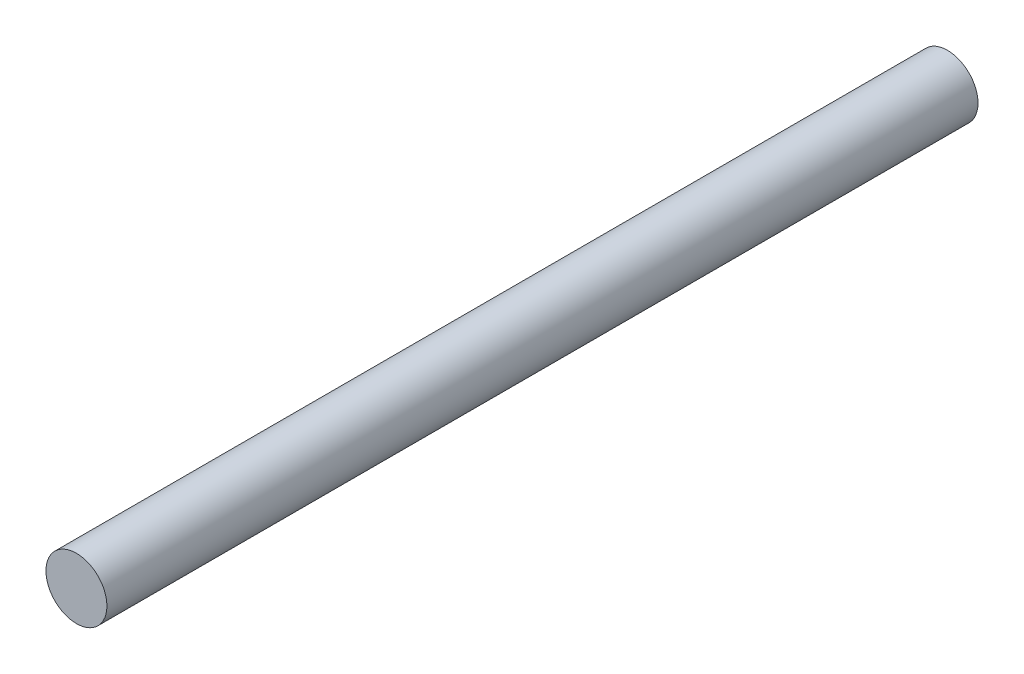
ISO-10303-21;
HEADER;
FILE_DESCRIPTION(('STEP AP214'),'2;1');
FILE_NAME('part.step','',(''),(''),'','','');
FILE_SCHEMA(('AUTOMOTIVE_DESIGN { 1 0 10303 214 1 1 1 1 }'));
ENDSEC;
DATA;
#1=APPLICATION_CONTEXT('core data for automotive mechanical design processes');
#2=APPLICATION_PROTOCOL_DEFINITION('international standard','automotive_design',2000,#1);
#3=PRODUCT_CONTEXT('',#1,'mechanical');
#4=PRODUCT('Part','Part','',(#3));
#5=PRODUCT_RELATED_PRODUCT_CATEGORY('part','',(#4));
#6=PRODUCT_DEFINITION_FORMATION('','',#4);
#7=PRODUCT_DEFINITION_CONTEXT('part definition',#1,'design');
#8=PRODUCT_DEFINITION('design','',#6,#7);
#9=PRODUCT_DEFINITION_SHAPE('','',#8);
#10=(LENGTH_UNIT() NAMED_UNIT(*) SI_UNIT(.MILLI.,.METRE.));
#11=(NAMED_UNIT(*) PLANE_ANGLE_UNIT() SI_UNIT($,.RADIAN.));
#12=(NAMED_UNIT(*) SI_UNIT($,.STERADIAN.) SOLID_ANGLE_UNIT());
#13=UNCERTAINTY_MEASURE_WITH_UNIT(LENGTH_MEASURE(1.E-05),#10,'distance_accuracy_value','');
#14=(GEOMETRIC_REPRESENTATION_CONTEXT(3) GLOBAL_UNCERTAINTY_ASSIGNED_CONTEXT((#13)) GLOBAL_UNIT_ASSIGNED_CONTEXT((#10,
#11,#12)) REPRESENTATION_CONTEXT('',''));
#15=CARTESIAN_POINT('',(0.,0.,0.));
#16=DIRECTION('',(0.,0.,1.));
#17=DIRECTION('',(1.,0.,0.));
#18=AXIS2_PLACEMENT_3D('',#15,#16,#17);
#19=CARTESIAN_POINT('',(0.,0.,-500.));
#20=DIRECTION('',(0.,0.,1.));
#21=DIRECTION('',(1.,0.,0.));
#22=AXIS2_PLACEMENT_3D('',#19,#20,#21);
#23=CYLINDRICAL_SURFACE('',#22,17.5);
#24=CARTESIAN_POINT('',(0.,0.,-500.));
#25=DIRECTION('',(0.,0.,1.));
#26=DIRECTION('',(1.,0.,0.));
#27=AXIS2_PLACEMENT_3D('',#24,#25,#26);
#28=CIRCLE('',#27,17.5);
#29=CARTESIAN_POINT('',(17.5,0.,-500.));
#30=VERTEX_POINT('',#29);
#31=EDGE_CURVE('E10',#30,#30,#28,.T.);
#32=ORIENTED_EDGE('',*,*,#31,.T.);
#33=EDGE_LOOP('',(#32));
#34=FACE_BOUND('',#33,.T.);
#35=CARTESIAN_POINT('',(0.,0.,0.));
#36=DIRECTION('',(0.,0.,1.));
#37=DIRECTION('',(1.,0.,0.));
#38=AXIS2_PLACEMENT_3D('',#35,#36,#37);
#39=CIRCLE('',#38,17.5);
#40=CARTESIAN_POINT('',(17.5,0.,0.));
#41=VERTEX_POINT('',#40);
#42=EDGE_CURVE('E42',#41,#41,#39,.T.);
#43=ORIENTED_EDGE('',*,*,#42,.F.);
#44=EDGE_LOOP('',(#43));
#45=FACE_BOUND('',#44,.T.);
#46=ADVANCED_FACE('F39',(#34,#45),#23,.T.);
#47=CARTESIAN_POINT('',(0.,0.,-500.));
#48=DIRECTION('',(0.,0.,1.));
#49=DIRECTION('',(1.,0.,0.));
#50=AXIS2_PLACEMENT_3D('',#47,#48,#49);
#51=PLANE('',#50);
#52=CARTESIAN_POINT('',(0.,0.,-500.));
#53=DIRECTION('',(0.,0.,1.));
#54=DIRECTION('',(1.,0.,0.));
#55=AXIS2_PLACEMENT_3D('',#52,#53,#54);
#56=CIRCLE('',#55,13.);
#57=CARTESIAN_POINT('',(13.,0.,-500.));
#58=VERTEX_POINT('',#57);
#59=EDGE_CURVE('E49',#58,#58,#56,.T.);
#60=ORIENTED_EDGE('',*,*,#59,.T.);
#61=EDGE_LOOP('',(#60));
#62=FACE_BOUND('',#61,.T.);
#63=ORIENTED_EDGE('',*,*,#31,.F.);
#64=EDGE_LOOP('',(#63));
#65=FACE_BOUND('',#64,.T.);
#66=ADVANCED_FACE('F69',(#62,#65),#51,.F.);
#67=CARTESIAN_POINT('',(0.,0.,0.));
#68=DIRECTION('',(0.,0.,1.));
#69=DIRECTION('',(1.,0.,0.));
#70=AXIS2_PLACEMENT_3D('',#67,#68,#69);
#71=PLANE('',#70);
#72=ORIENTED_EDGE('',*,*,#42,.T.);
#73=EDGE_LOOP('',(#72));
#74=FACE_BOUND('',#73,.T.);
#75=ADVANCED_FACE('F65',(#74),#71,.T.);
#76=CARTESIAN_POINT('',(0.,0.,-500.));
#77=DIRECTION('',(0.,0.,1.));
#78=DIRECTION('',(1.,0.,0.));
#79=AXIS2_PLACEMENT_3D('',#76,#77,#78);
#80=CYLINDRICAL_SURFACE('',#79,13.);
#81=ORIENTED_EDGE('',*,*,#59,.F.);
#82=EDGE_LOOP('',(#81));
#83=FACE_BOUND('',#82,.T.);
#84=CARTESIAN_POINT('',(0.,0.,-440.));
#85=DIRECTION('',(0.,0.,1.));
#86=DIRECTION('',(1.,0.,0.));
#87=AXIS2_PLACEMENT_3D('',#84,#85,#86);
#88=CIRCLE('',#87,13.);
#89=CARTESIAN_POINT('',(13.,0.,-440.));
#90=VERTEX_POINT('',#89);
#91=EDGE_CURVE('E53',#90,#90,#88,.T.);
#92=ORIENTED_EDGE('',*,*,#91,.T.);
#93=EDGE_LOOP('',(#92));
#94=FACE_BOUND('',#93,.T.);
#95=ADVANCED_FACE('F57',(#83,#94),#80,.F.);
#96=CARTESIAN_POINT('',(13.,0.,-440.));
#97=DIRECTION('',(0.,0.,1.));
#98=DIRECTION('',(1.,0.,0.));
#99=AXIS2_PLACEMENT_3D('',#96,#97,#98);
#100=PLANE('',#99);
#101=ORIENTED_EDGE('',*,*,#91,.F.);
#102=EDGE_LOOP('',(#101));
#103=FACE_BOUND('',#102,.T.);
#104=ADVANCED_FACE('F59',(#103),#100,.F.);
#105=CLOSED_SHELL('',(#46,#66,#75,#95,#104));
#106=MANIFOLD_SOLID_BREP('B2',#105);
#107=ADVANCED_BREP_SHAPE_REPRESENTATION('',(#18,#106),#14);
#108=SHAPE_DEFINITION_REPRESENTATION(#9,#107);
ENDSEC;
END-ISO-10303-21;
